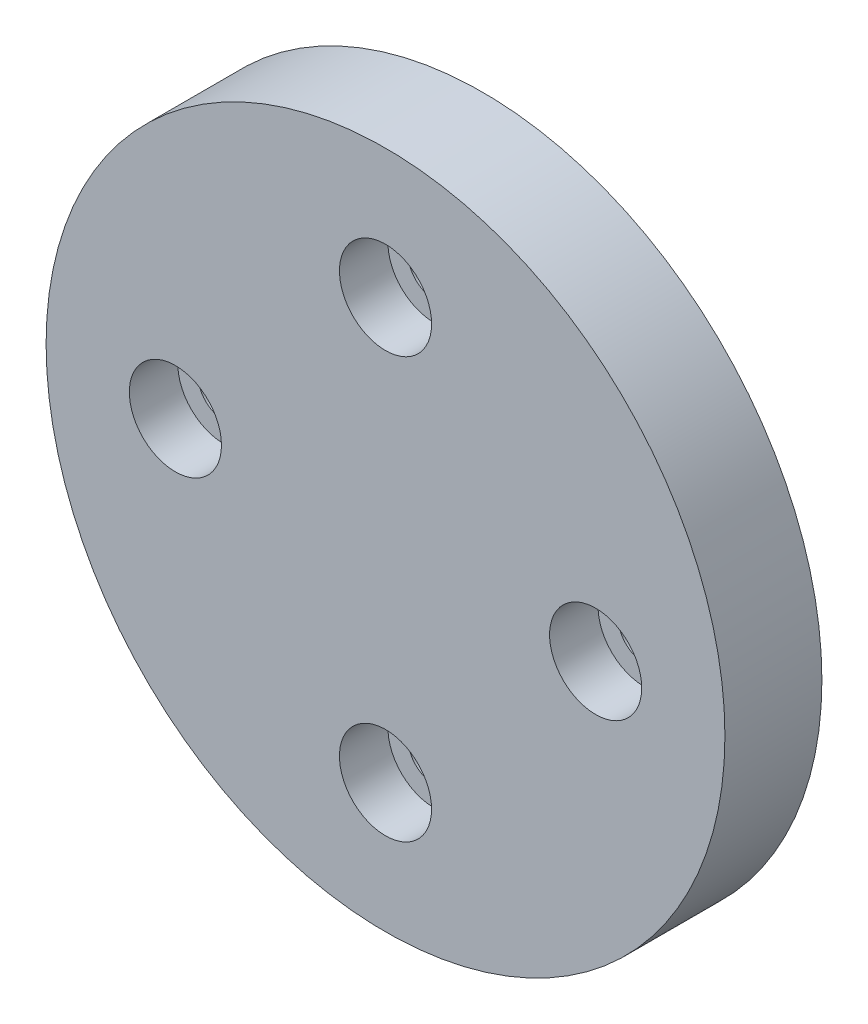
ISO-10303-21;
HEADER;
FILE_DESCRIPTION(('STEP AP214'),'2;1');
FILE_NAME('part.step','',(''),(''),'','','');
FILE_SCHEMA(('AUTOMOTIVE_DESIGN { 1 0 10303 214 1 1 1 1 }'));
ENDSEC;
DATA;
#1=APPLICATION_CONTEXT('core data for automotive mechanical design processes');
#2=APPLICATION_PROTOCOL_DEFINITION('international standard','automotive_design',2000,#1);
#3=PRODUCT_CONTEXT('',#1,'mechanical');
#4=PRODUCT('Part','Part','',(#3));
#5=PRODUCT_RELATED_PRODUCT_CATEGORY('part','',(#4));
#6=PRODUCT_DEFINITION_FORMATION('','',#4);
#7=PRODUCT_DEFINITION_CONTEXT('part definition',#1,'design');
#8=PRODUCT_DEFINITION('design','',#6,#7);
#9=PRODUCT_DEFINITION_SHAPE('','',#8);
#10=(LENGTH_UNIT() NAMED_UNIT(*) SI_UNIT(.MILLI.,.METRE.));
#11=(NAMED_UNIT(*) PLANE_ANGLE_UNIT() SI_UNIT($,.RADIAN.));
#12=(NAMED_UNIT(*) SI_UNIT($,.STERADIAN.) SOLID_ANGLE_UNIT());
#13=UNCERTAINTY_MEASURE_WITH_UNIT(LENGTH_MEASURE(1.E-05),#10,'distance_accuracy_value','');
#14=(GEOMETRIC_REPRESENTATION_CONTEXT(3) GLOBAL_UNCERTAINTY_ASSIGNED_CONTEXT((#13)) GLOBAL_UNIT_ASSIGNED_CONTEXT((#10,
#11,#12)) REPRESENTATION_CONTEXT('',''));
#15=CARTESIAN_POINT('',(0.,0.,0.));
#16=DIRECTION('',(0.,0.,1.));
#17=DIRECTION('',(1.,0.,0.));
#18=AXIS2_PLACEMENT_3D('',#15,#16,#17);
#19=CARTESIAN_POINT('',(-13.,0.,6.));
#20=DIRECTION('',(0.,0.,-1.));
#21=DIRECTION('',(-1.,0.,0.));
#22=AXIS2_PLACEMENT_3D('',#19,#20,#21);
#23=CYLINDRICAL_SURFACE('',#22,2.85);
#24=CARTESIAN_POINT('',(-13.,0.,3.));
#25=DIRECTION('',(0.,0.,1.));
#26=DIRECTION('',(1.,0.,0.));
#27=AXIS2_PLACEMENT_3D('',#24,#25,#26);
#28=CIRCLE('',#27,2.85);
#29=CARTESIAN_POINT('',(-10.15,0.,3.));
#30=VERTEX_POINT('',#29);
#31=EDGE_CURVE('E10',#30,#30,#28,.T.);
#32=ORIENTED_EDGE('',*,*,#31,.F.);
#33=EDGE_LOOP('',(#32));
#34=FACE_BOUND('',#33,.T.);
#35=CARTESIAN_POINT('',(-13.,0.,6.));
#36=DIRECTION('',(0.,0.,1.));
#37=DIRECTION('',(1.,0.,0.));
#38=AXIS2_PLACEMENT_3D('',#35,#36,#37);
#39=CIRCLE('',#38,2.85);
#40=CARTESIAN_POINT('',(-10.15,0.,6.));
#41=VERTEX_POINT('',#40);
#42=EDGE_CURVE('E67',#41,#41,#39,.T.);
#43=ORIENTED_EDGE('',*,*,#42,.T.);
#44=EDGE_LOOP('',(#43));
#45=FACE_BOUND('',#44,.T.);
#46=ADVANCED_FACE('F39',(#34,#45),#23,.F.);
#47=CARTESIAN_POINT('',(0.,13.,6.));
#48=DIRECTION('',(0.,0.,-1.));
#49=DIRECTION('',(-1.,0.,0.));
#50=AXIS2_PLACEMENT_3D('',#47,#48,#49);
#51=CYLINDRICAL_SURFACE('',#50,2.85);
#52=CARTESIAN_POINT('',(0.,13.,3.));
#53=DIRECTION('',(0.,0.,1.));
#54=DIRECTION('',(1.,0.,0.));
#55=AXIS2_PLACEMENT_3D('',#52,#53,#54);
#56=CIRCLE('',#55,2.85);
#57=CARTESIAN_POINT('',(2.85000000000005,13.,3.));
#58=VERTEX_POINT('',#57);
#59=EDGE_CURVE('E46',#58,#58,#56,.T.);
#60=ORIENTED_EDGE('',*,*,#59,.F.);
#61=EDGE_LOOP('',(#60));
#62=FACE_BOUND('',#61,.T.);
#63=CARTESIAN_POINT('',(0.,13.,6.));
#64=DIRECTION('',(0.,0.,1.));
#65=DIRECTION('',(1.,0.,0.));
#66=AXIS2_PLACEMENT_3D('',#63,#64,#65);
#67=CIRCLE('',#66,2.85);
#68=CARTESIAN_POINT('',(2.85000000000005,13.,6.));
#69=VERTEX_POINT('',#68);
#70=EDGE_CURVE('E70',#69,#69,#67,.T.);
#71=ORIENTED_EDGE('',*,*,#70,.T.);
#72=EDGE_LOOP('',(#71));
#73=FACE_BOUND('',#72,.T.);
#74=ADVANCED_FACE('F156',(#62,#73),#51,.F.);
#75=CARTESIAN_POINT('',(13.,0.,6.));
#76=DIRECTION('',(0.,0.,-1.));
#77=DIRECTION('',(-1.,0.,0.));
#78=AXIS2_PLACEMENT_3D('',#75,#76,#77);
#79=CYLINDRICAL_SURFACE('',#78,2.85);
#80=CARTESIAN_POINT('',(13.,0.,3.));
#81=DIRECTION('',(0.,0.,1.));
#82=DIRECTION('',(1.,0.,0.));
#83=AXIS2_PLACEMENT_3D('',#80,#81,#82);
#84=CIRCLE('',#83,2.85);
#85=CARTESIAN_POINT('',(15.85,0.,3.));
#86=VERTEX_POINT('',#85);
#87=EDGE_CURVE('E50',#86,#86,#84,.T.);
#88=ORIENTED_EDGE('',*,*,#87,.F.);
#89=EDGE_LOOP('',(#88));
#90=FACE_BOUND('',#89,.T.);
#91=CARTESIAN_POINT('',(13.,0.,6.));
#92=DIRECTION('',(0.,0.,1.));
#93=DIRECTION('',(1.,0.,0.));
#94=AXIS2_PLACEMENT_3D('',#91,#92,#93);
#95=CIRCLE('',#94,2.85);
#96=CARTESIAN_POINT('',(15.85,0.,6.));
#97=VERTEX_POINT('',#96);
#98=EDGE_CURVE('E73',#97,#97,#95,.T.);
#99=ORIENTED_EDGE('',*,*,#98,.T.);
#100=EDGE_LOOP('',(#99));
#101=FACE_BOUND('',#100,.T.);
#102=ADVANCED_FACE('F114',(#90,#101),#79,.F.);
#103=CARTESIAN_POINT('',(-1.36167772214882E-13,-13.,6.));
#104=DIRECTION('',(0.,0.,-1.));
#105=DIRECTION('',(-1.,0.,0.));
#106=AXIS2_PLACEMENT_3D('',#103,#104,#105);
#107=CYLINDRICAL_SURFACE('',#106,2.85);
#108=CARTESIAN_POINT('',(-1.36167772214882E-13,-13.,3.));
#109=DIRECTION('',(0.,0.,1.));
#110=DIRECTION('',(1.,0.,0.));
#111=AXIS2_PLACEMENT_3D('',#108,#109,#110);
#112=CIRCLE('',#111,2.85);
#113=CARTESIAN_POINT('',(2.84999999999986,-13.,3.));
#114=VERTEX_POINT('',#113);
#115=EDGE_CURVE('E54',#114,#114,#112,.T.);
#116=ORIENTED_EDGE('',*,*,#115,.F.);
#117=EDGE_LOOP('',(#116));
#118=FACE_BOUND('',#117,.T.);
#119=CARTESIAN_POINT('',(-1.36167772214882E-13,-13.,6.));
#120=DIRECTION('',(0.,0.,1.));
#121=DIRECTION('',(1.,0.,0.));
#122=AXIS2_PLACEMENT_3D('',#119,#120,#121);
#123=CIRCLE('',#122,2.85);
#124=CARTESIAN_POINT('',(2.84999999999986,-13.,6.));
#125=VERTEX_POINT('',#124);
#126=EDGE_CURVE('E63',#125,#125,#123,.T.);
#127=ORIENTED_EDGE('',*,*,#126,.T.);
#128=EDGE_LOOP('',(#127));
#129=FACE_BOUND('',#128,.T.);
#130=ADVANCED_FACE('F41',(#118,#129),#107,.F.);
#131=CARTESIAN_POINT('',(0.,0.,6.));
#132=DIRECTION('',(0.,0.,-1.));
#133=DIRECTION('',(-1.,0.,0.));
#134=AXIS2_PLACEMENT_3D('',#131,#132,#133);
#135=CYLINDRICAL_SURFACE('',#134,21.);
#136=CARTESIAN_POINT('',(0.,0.,6.));
#137=DIRECTION('',(0.,0.,1.));
#138=DIRECTION('',(1.,0.,0.));
#139=AXIS2_PLACEMENT_3D('',#136,#137,#138);
#140=CIRCLE('',#139,21.);
#141=CARTESIAN_POINT('',(21.,0.,6.));
#142=VERTEX_POINT('',#141);
#143=EDGE_CURVE('E59',#142,#142,#140,.T.);
#144=ORIENTED_EDGE('',*,*,#143,.F.);
#145=EDGE_LOOP('',(#144));
#146=FACE_BOUND('',#145,.T.);
#147=CARTESIAN_POINT('',(0.,0.,0.));
#148=DIRECTION('',(0.,0.,1.));
#149=DIRECTION('',(1.,0.,0.));
#150=AXIS2_PLACEMENT_3D('',#147,#148,#149);
#151=CIRCLE('',#150,21.);
#152=CARTESIAN_POINT('',(21.,0.,0.));
#153=VERTEX_POINT('',#152);
#154=EDGE_CURVE('E60',#153,#153,#151,.T.);
#155=ORIENTED_EDGE('',*,*,#154,.T.);
#156=EDGE_LOOP('',(#155));
#157=FACE_BOUND('',#156,.T.);
#158=ADVANCED_FACE('F113',(#146,#157),#135,.T.);
#159=CARTESIAN_POINT('',(0.,0.,6.));
#160=DIRECTION('',(0.,0.,1.));
#161=DIRECTION('',(1.,0.,0.));
#162=AXIS2_PLACEMENT_3D('',#159,#160,#161);
#163=PLANE('',#162);
#164=ORIENTED_EDGE('',*,*,#126,.F.);
#165=EDGE_LOOP('',(#164));
#166=FACE_BOUND('',#165,.T.);
#167=ORIENTED_EDGE('',*,*,#98,.F.);
#168=EDGE_LOOP('',(#167));
#169=FACE_BOUND('',#168,.T.);
#170=ORIENTED_EDGE('',*,*,#70,.F.);
#171=EDGE_LOOP('',(#170));
#172=FACE_BOUND('',#171,.T.);
#173=ORIENTED_EDGE('',*,*,#42,.F.);
#174=EDGE_LOOP('',(#173));
#175=FACE_BOUND('',#174,.T.);
#176=ORIENTED_EDGE('',*,*,#143,.T.);
#177=EDGE_LOOP('',(#176));
#178=FACE_BOUND('',#177,.T.);
#179=ADVANCED_FACE('F117',(#166,#169,#172,#175,#178),#163,.T.);
#180=CARTESIAN_POINT('',(0.,0.,0.));
#181=DIRECTION('',(0.,0.,1.));
#182=DIRECTION('',(1.,0.,0.));
#183=AXIS2_PLACEMENT_3D('',#180,#181,#182);
#184=PLANE('',#183);
#185=ORIENTED_EDGE('',*,*,#154,.F.);
#186=EDGE_LOOP('',(#185));
#187=FACE_BOUND('',#186,.T.);
#188=CARTESIAN_POINT('',(13.,0.,0.));
#189=DIRECTION('',(0.,0.,1.));
#190=DIRECTION('',(1.,0.,0.));
#191=AXIS2_PLACEMENT_3D('',#188,#189,#190);
#192=CIRCLE('',#191,1.6);
#193=CARTESIAN_POINT('',(14.6,0.,0.));
#194=VERTEX_POINT('',#193);
#195=EDGE_CURVE('E78',#194,#194,#192,.T.);
#196=ORIENTED_EDGE('',*,*,#195,.T.);
#197=EDGE_LOOP('',(#196));
#198=FACE_BOUND('',#197,.T.);
#199=CARTESIAN_POINT('',(0.,13.,0.));
#200=DIRECTION('',(0.,0.,1.));
#201=DIRECTION('',(1.,0.,0.));
#202=AXIS2_PLACEMENT_3D('',#199,#200,#201);
#203=CIRCLE('',#202,1.6);
#204=CARTESIAN_POINT('',(1.60000000000005,13.,0.));
#205=VERTEX_POINT('',#204);
#206=EDGE_CURVE('E84',#205,#205,#203,.T.);
#207=ORIENTED_EDGE('',*,*,#206,.T.);
#208=EDGE_LOOP('',(#207));
#209=FACE_BOUND('',#208,.T.);
#210=CARTESIAN_POINT('',(-13.,0.,0.));
#211=DIRECTION('',(0.,0.,1.));
#212=DIRECTION('',(1.,0.,0.));
#213=AXIS2_PLACEMENT_3D('',#210,#211,#212);
#214=CIRCLE('',#213,1.6);
#215=CARTESIAN_POINT('',(-11.4,0.,0.));
#216=VERTEX_POINT('',#215);
#217=EDGE_CURVE('E90',#216,#216,#214,.T.);
#218=ORIENTED_EDGE('',*,*,#217,.T.);
#219=EDGE_LOOP('',(#218));
#220=FACE_BOUND('',#219,.T.);
#221=CARTESIAN_POINT('',(-1.36167772214882E-13,-13.,0.));
#222=DIRECTION('',(0.,0.,1.));
#223=DIRECTION('',(1.,0.,0.));
#224=AXIS2_PLACEMENT_3D('',#221,#222,#223);
#225=CIRCLE('',#224,1.6);
#226=CARTESIAN_POINT('',(1.59999999999986,-13.,0.));
#227=VERTEX_POINT('',#226);
#228=EDGE_CURVE('E96',#227,#227,#225,.T.);
#229=ORIENTED_EDGE('',*,*,#228,.T.);
#230=EDGE_LOOP('',(#229));
#231=FACE_BOUND('',#230,.T.);
#232=ADVANCED_FACE('F120',(#187,#198,#209,#220,#231),#184,.F.);
#233=CARTESIAN_POINT('',(13.,0.,3.));
#234=DIRECTION('',(0.,0.,-1.));
#235=DIRECTION('',(-1.,0.,0.));
#236=AXIS2_PLACEMENT_3D('',#233,#234,#235);
#237=CYLINDRICAL_SURFACE('',#236,1.6);
#238=CARTESIAN_POINT('',(13.,0.,3.));
#239=DIRECTION('',(0.,0.,1.));
#240=DIRECTION('',(1.,0.,0.));
#241=AXIS2_PLACEMENT_3D('',#238,#239,#240);
#242=CIRCLE('',#241,1.6);
#243=CARTESIAN_POINT('',(14.6,0.,3.));
#244=VERTEX_POINT('',#243);
#245=EDGE_CURVE('E81',#244,#244,#242,.T.);
#246=ORIENTED_EDGE('',*,*,#245,.T.);
#247=EDGE_LOOP('',(#246));
#248=FACE_BOUND('',#247,.T.);
#249=ORIENTED_EDGE('',*,*,#195,.F.);
#250=EDGE_LOOP('',(#249));
#251=FACE_BOUND('',#250,.T.);
#252=ADVANCED_FACE('F137',(#248,#251),#237,.F.);
#253=CARTESIAN_POINT('',(0.,0.,3.));
#254=DIRECTION('',(0.,0.,1.));
#255=DIRECTION('',(1.,0.,0.));
#256=AXIS2_PLACEMENT_3D('',#253,#254,#255);
#257=PLANE('',#256);
#258=ORIENTED_EDGE('',*,*,#245,.F.);
#259=EDGE_LOOP('',(#258));
#260=FACE_BOUND('',#259,.T.);
#261=ORIENTED_EDGE('',*,*,#87,.T.);
#262=EDGE_LOOP('',(#261));
#263=FACE_BOUND('',#262,.T.);
#264=ADVANCED_FACE('F172',(#260,#263),#257,.T.);
#265=CARTESIAN_POINT('',(0.,13.,3.));
#266=DIRECTION('',(0.,0.,-1.));
#267=DIRECTION('',(-1.,0.,0.));
#268=AXIS2_PLACEMENT_3D('',#265,#266,#267);
#269=CYLINDRICAL_SURFACE('',#268,1.6);
#270=CARTESIAN_POINT('',(0.,13.,3.));
#271=DIRECTION('',(0.,0.,1.));
#272=DIRECTION('',(1.,0.,0.));
#273=AXIS2_PLACEMENT_3D('',#270,#271,#272);
#274=CIRCLE('',#273,1.6);
#275=CARTESIAN_POINT('',(1.60000000000005,13.,3.));
#276=VERTEX_POINT('',#275);
#277=EDGE_CURVE('E87',#276,#276,#274,.T.);
#278=ORIENTED_EDGE('',*,*,#277,.T.);
#279=EDGE_LOOP('',(#278));
#280=FACE_BOUND('',#279,.T.);
#281=ORIENTED_EDGE('',*,*,#206,.F.);
#282=EDGE_LOOP('',(#281));
#283=FACE_BOUND('',#282,.T.);
#284=ADVANCED_FACE('F174',(#280,#283),#269,.F.);
#285=CARTESIAN_POINT('',(0.,0.,3.));
#286=DIRECTION('',(0.,0.,1.));
#287=DIRECTION('',(1.,0.,0.));
#288=AXIS2_PLACEMENT_3D('',#285,#286,#287);
#289=PLANE('',#288);
#290=ORIENTED_EDGE('',*,*,#277,.F.);
#291=EDGE_LOOP('',(#290));
#292=FACE_BOUND('',#291,.T.);
#293=ORIENTED_EDGE('',*,*,#59,.T.);
#294=EDGE_LOOP('',(#293));
#295=FACE_BOUND('',#294,.T.);
#296=ADVANCED_FACE('F181',(#292,#295),#289,.T.);
#297=CARTESIAN_POINT('',(-13.,0.,3.));
#298=DIRECTION('',(0.,0.,-1.));
#299=DIRECTION('',(-1.,0.,0.));
#300=AXIS2_PLACEMENT_3D('',#297,#298,#299);
#301=CYLINDRICAL_SURFACE('',#300,1.6);
#302=CARTESIAN_POINT('',(-13.,0.,3.));
#303=DIRECTION('',(0.,0.,1.));
#304=DIRECTION('',(1.,0.,0.));
#305=AXIS2_PLACEMENT_3D('',#302,#303,#304);
#306=CIRCLE('',#305,1.6);
#307=CARTESIAN_POINT('',(-11.4,0.,3.));
#308=VERTEX_POINT('',#307);
#309=EDGE_CURVE('E93',#308,#308,#306,.T.);
#310=ORIENTED_EDGE('',*,*,#309,.T.);
#311=EDGE_LOOP('',(#310));
#312=FACE_BOUND('',#311,.T.);
#313=ORIENTED_EDGE('',*,*,#217,.F.);
#314=EDGE_LOOP('',(#313));
#315=FACE_BOUND('',#314,.T.);
#316=ADVANCED_FACE('F152',(#312,#315),#301,.F.);
#317=CARTESIAN_POINT('',(0.,0.,3.));
#318=DIRECTION('',(0.,0.,1.));
#319=DIRECTION('',(1.,0.,0.));
#320=AXIS2_PLACEMENT_3D('',#317,#318,#319);
#321=PLANE('',#320);
#322=ORIENTED_EDGE('',*,*,#309,.F.);
#323=EDGE_LOOP('',(#322));
#324=FACE_BOUND('',#323,.T.);
#325=ORIENTED_EDGE('',*,*,#31,.T.);
#326=EDGE_LOOP('',(#325));
#327=FACE_BOUND('',#326,.T.);
#328=ADVANCED_FACE('F147',(#324,#327),#321,.T.);
#329=CARTESIAN_POINT('',(-1.36167772214882E-13,-13.,3.));
#330=DIRECTION('',(0.,0.,-1.));
#331=DIRECTION('',(-1.,0.,0.));
#332=AXIS2_PLACEMENT_3D('',#329,#330,#331);
#333=CYLINDRICAL_SURFACE('',#332,1.6);
#334=CARTESIAN_POINT('',(-1.36167772214882E-13,-13.,3.));
#335=DIRECTION('',(0.,0.,1.));
#336=DIRECTION('',(1.,0.,0.));
#337=AXIS2_PLACEMENT_3D('',#334,#335,#336);
#338=CIRCLE('',#337,1.6);
#339=CARTESIAN_POINT('',(1.59999999999986,-13.,3.));
#340=VERTEX_POINT('',#339);
#341=EDGE_CURVE('E64',#340,#340,#338,.T.);
#342=ORIENTED_EDGE('',*,*,#341,.T.);
#343=EDGE_LOOP('',(#342));
#344=FACE_BOUND('',#343,.T.);
#345=ORIENTED_EDGE('',*,*,#228,.F.);
#346=EDGE_LOOP('',(#345));
#347=FACE_BOUND('',#346,.T.);
#348=ADVANCED_FACE('F102',(#344,#347),#333,.F.);
#349=CARTESIAN_POINT('',(0.,0.,3.));
#350=DIRECTION('',(0.,0.,1.));
#351=DIRECTION('',(1.,0.,0.));
#352=AXIS2_PLACEMENT_3D('',#349,#350,#351);
#353=PLANE('',#352);
#354=ORIENTED_EDGE('',*,*,#341,.F.);
#355=EDGE_LOOP('',(#354));
#356=FACE_BOUND('',#355,.T.);
#357=ORIENTED_EDGE('',*,*,#115,.T.);
#358=EDGE_LOOP('',(#357));
#359=FACE_BOUND('',#358,.T.);
#360=ADVANCED_FACE('F105',(#356,#359),#353,.T.);
#361=CLOSED_SHELL('',(#46,#74,#102,#130,#158,#179,#232,#252,#264,#284,#296,#316,#328,#348,#360));
#362=MANIFOLD_SOLID_BREP('B2',#361);
#363=ADVANCED_BREP_SHAPE_REPRESENTATION('',(#18,#362),#14);
#364=SHAPE_DEFINITION_REPRESENTATION(#9,#363);
ENDSEC;
END-ISO-10303-21;
